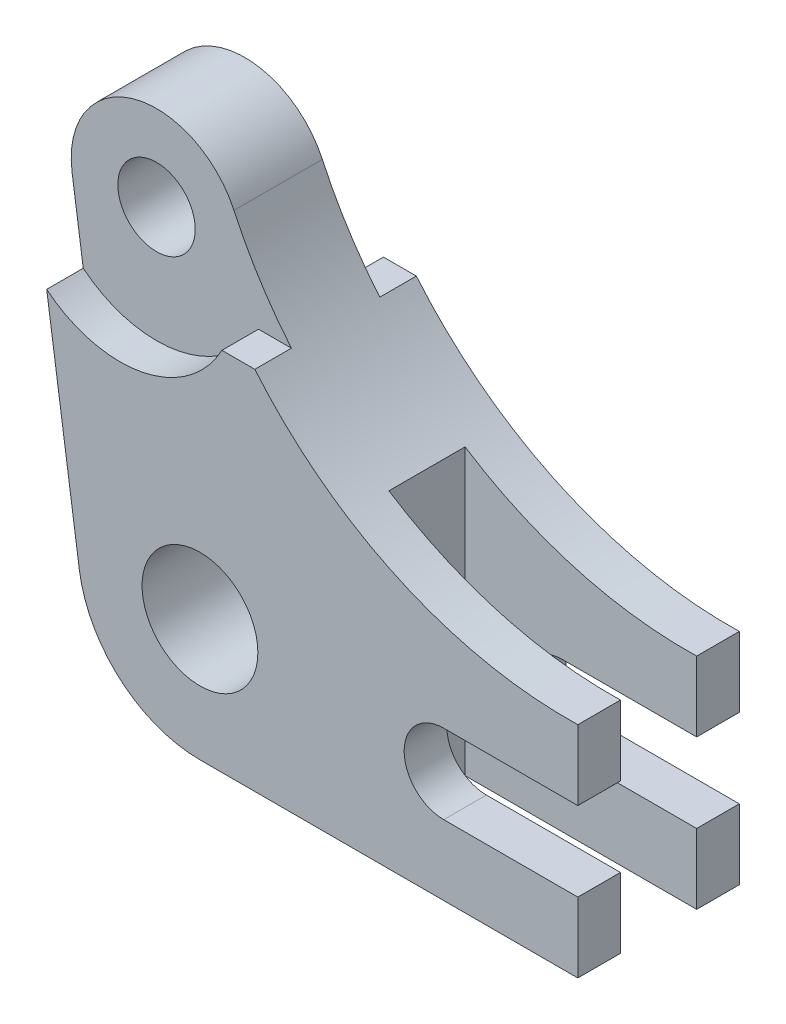
ISO-10303-21;
HEADER;
FILE_DESCRIPTION(('STEP AP214'),'2;1');
FILE_NAME('part.step','',(''),(''),'','','');
FILE_SCHEMA(('AUTOMOTIVE_DESIGN { 1 0 10303 214 1 1 1 1 }'));
ENDSEC;
DATA;
#1=APPLICATION_CONTEXT('core data for automotive mechanical design processes');
#2=APPLICATION_PROTOCOL_DEFINITION('international standard','automotive_design',2000,#1);
#3=PRODUCT_CONTEXT('',#1,'mechanical');
#4=PRODUCT('Part','Part','',(#3));
#5=PRODUCT_RELATED_PRODUCT_CATEGORY('part','',(#4));
#6=PRODUCT_DEFINITION_FORMATION('','',#4);
#7=PRODUCT_DEFINITION_CONTEXT('part definition',#1,'design');
#8=PRODUCT_DEFINITION('design','',#6,#7);
#9=PRODUCT_DEFINITION_SHAPE('','',#8);
#10=(LENGTH_UNIT() NAMED_UNIT(*) SI_UNIT(.MILLI.,.METRE.));
#11=(NAMED_UNIT(*) PLANE_ANGLE_UNIT() SI_UNIT($,.RADIAN.));
#12=(NAMED_UNIT(*) SI_UNIT($,.STERADIAN.) SOLID_ANGLE_UNIT());
#13=UNCERTAINTY_MEASURE_WITH_UNIT(LENGTH_MEASURE(1.E-05),#10,'distance_accuracy_value','');
#14=(GEOMETRIC_REPRESENTATION_CONTEXT(3) GLOBAL_UNCERTAINTY_ASSIGNED_CONTEXT((#13)) GLOBAL_UNIT_ASSIGNED_CONTEXT((#10,
#11,#12)) REPRESENTATION_CONTEXT('',''));
#15=CARTESIAN_POINT('',(0.,0.,0.));
#16=DIRECTION('',(0.,0.,1.));
#17=DIRECTION('',(1.,0.,0.));
#18=AXIS2_PLACEMENT_3D('',#15,#16,#17);
#19=CARTESIAN_POINT('',(60.3980496611483,82.9808461809184,26.5));
#20=DIRECTION('',(0.,0.,-1.));
#21=DIRECTION('',(-1.,0.,0.));
#22=AXIS2_PLACEMENT_3D('',#19,#20,#21);
#23=CYLINDRICAL_SURFACE('',#22,67.);
#24=CARTESIAN_POINT('',(60.3980496611483,82.9808461809184,0.));
#25=DIRECTION('',(0.,0.,1.));
#26=DIRECTION('',(1.,0.,0.));
#27=AXIS2_PLACEMENT_3D('',#24,#25,#26);
#28=CIRCLE('',#27,67.);
#29=CARTESIAN_POINT('',(9.00109584506863,40.,0.));
#30=VERTEX_POINT('',#29);
#31=CARTESIAN_POINT('',(62.,16.,0.));
#32=VERTEX_POINT('',#31);
#33=EDGE_CURVE('E214',#30,#32,#28,.T.);
#34=ORIENTED_EDGE('',*,*,#33,.F.);
#35=DIRECTION('',(0.,0.,1.));
#36=VECTOR('',#35,1.);
#37=CARTESIAN_POINT('',(9.0010958450686,40.,-181.42595288809));
#38=LINE('',#37,#36);
#39=CARTESIAN_POINT('',(9.00109584506863,40.,6.));
#40=VERTEX_POINT('',#39);
#41=EDGE_CURVE('E58',#30,#40,#38,.T.);
#42=ORIENTED_EDGE('',*,*,#41,.T.);
#43=CARTESIAN_POINT('',(60.3980496611483,82.9808461809184,6.));
#44=DIRECTION('',(0.,0.,1.));
#45=DIRECTION('',(1.,0.,0.));
#46=AXIS2_PLACEMENT_3D('',#43,#44,#45);
#47=CIRCLE('',#46,67.);
#48=CARTESIAN_POINT('',(-0.421043253028427,54.8732326732452,6.));
#49=VERTEX_POINT('',#48);
#50=EDGE_CURVE('E62',#49,#40,#47,.T.);
#51=ORIENTED_EDGE('',*,*,#50,.F.);
#52=DIRECTION('',(0.,0.,-1.));
#53=VECTOR('',#52,1.);
#54=CARTESIAN_POINT('',(-0.421043253028427,54.8732326732452,26.5));
#55=LINE('',#54,#53);
#56=CARTESIAN_POINT('',(-0.421043253028427,54.8732326732452,20.5));
#57=VERTEX_POINT('',#56);
#58=EDGE_CURVE('E369',#57,#49,#55,.T.);
#59=ORIENTED_EDGE('',*,*,#58,.F.);
#60=CARTESIAN_POINT('',(60.3980496611483,82.9808461809184,20.5));
#61=DIRECTION('',(0.,0.,1.));
#62=DIRECTION('',(1.,0.,0.));
#63=AXIS2_PLACEMENT_3D('',#60,#61,#62);
#64=CIRCLE('',#63,67.);
#65=CARTESIAN_POINT('',(9.00109584506861,40.,20.5));
#66=VERTEX_POINT('',#65);
#67=EDGE_CURVE('E238',#57,#66,#64,.T.);
#68=ORIENTED_EDGE('',*,*,#67,.T.);
#69=DIRECTION('',(0.,0.,-1.));
#70=VECTOR('',#69,1.);
#71=CARTESIAN_POINT('',(9.0010958450686,40.,206.67595288809));
#72=LINE('',#71,#70);
#73=CARTESIAN_POINT('',(9.00109584506862,40.,26.5));
#74=VERTEX_POINT('',#73);
#75=EDGE_CURVE('E255',#74,#66,#72,.T.);
#76=ORIENTED_EDGE('',*,*,#75,.F.);
#77=CARTESIAN_POINT('',(60.3980496611483,82.9808461809184,26.5));
#78=DIRECTION('',(0.,0.,1.));
#79=DIRECTION('',(1.,0.,0.));
#80=AXIS2_PLACEMENT_3D('',#77,#78,#79);
#81=CIRCLE('',#80,67.);
#82=CARTESIAN_POINT('',(62.,16.,26.5));
#83=VERTEX_POINT('',#82);
#84=EDGE_CURVE('E317',#74,#83,#81,.T.);
#85=ORIENTED_EDGE('',*,*,#84,.T.);
#86=DIRECTION('',(0.,0.,-1.));
#87=VECTOR('',#86,1.);
#88=CARTESIAN_POINT('',(62.,16.,26.5));
#89=LINE('',#88,#87);
#90=CARTESIAN_POINT('',(62.,16.,19.5));
#91=VERTEX_POINT('',#90);
#92=EDGE_CURVE('E372',#83,#91,#89,.T.);
#93=ORIENTED_EDGE('',*,*,#92,.T.);
#94=CARTESIAN_POINT('',(60.3980496611483,82.9808461809184,19.5));
#95=DIRECTION('',(0.,0.,1.));
#96=DIRECTION('',(1.,0.,0.));
#97=AXIS2_PLACEMENT_3D('',#94,#95,#96);
#98=CIRCLE('',#97,67.);
#99=CARTESIAN_POINT('',(24.,26.7297841388149,19.5));
#100=VERTEX_POINT('',#99);
#101=EDGE_CURVE('E301',#100,#91,#98,.T.);
#102=ORIENTED_EDGE('',*,*,#101,.F.);
#103=DIRECTION('',(0.,0.,-1.));
#104=VECTOR('',#103,1.);
#105=CARTESIAN_POINT('',(24.,26.7297841388149,26.5));
#106=LINE('',#105,#104);
#107=CARTESIAN_POINT('',(24.,26.7297841388149,7.));
#108=VERTEX_POINT('',#107);
#109=EDGE_CURVE('E303',#100,#108,#106,.T.);
#110=ORIENTED_EDGE('',*,*,#109,.T.);
#111=CARTESIAN_POINT('',(60.3980496611483,82.9808461809184,7.));
#112=DIRECTION('',(0.,0.,1.));
#113=DIRECTION('',(1.,0.,0.));
#114=AXIS2_PLACEMENT_3D('',#111,#112,#113);
#115=CIRCLE('',#114,67.);
#116=CARTESIAN_POINT('',(62.,16.,7.));
#117=VERTEX_POINT('',#116);
#118=EDGE_CURVE('E294',#108,#117,#115,.T.);
#119=ORIENTED_EDGE('',*,*,#118,.T.);
#120=EDGE_CURVE('E371',#117,#32,#89,.T.);
#121=ORIENTED_EDGE('',*,*,#120,.T.);
#122=EDGE_LOOP('',(#34,#42,#51,#59,#68,#76,#85,#93,#102,#110,#119,#121));
#123=FACE_BOUND('',#122,.T.);
#124=ADVANCED_FACE('F41',(#123),#23,.F.);
#125=CARTESIAN_POINT('',(-19.7951586474625,-2.85511718179681,26.5));
#126=DIRECTION('',(0.989757932373124,0.142755859089841,0.));
#127=DIRECTION('',(-0.142755859089841,0.989757932373124,0.));
#128=AXIS2_PLACEMENT_3D('',#125,#126,#127);
#129=PLANE('',#128);
#130=DIRECTION('',(0.,0.,1.));
#131=VECTOR('',#130,1.);
#132=CARTESIAN_POINT('',(-25.1523892703726,34.2877471348307,-181.42595288809));
#133=LINE('',#132,#131);
#134=CARTESIAN_POINT('',(-25.1523892703726,34.2877471348307,0.));
#135=VERTEX_POINT('',#134);
#136=CARTESIAN_POINT('',(-25.1523892703726,34.2877471348307,6.));
#137=VERTEX_POINT('',#136);
#138=EDGE_CURVE('E217',#135,#137,#133,.T.);
#139=ORIENTED_EDGE('',*,*,#138,.F.);
#140=DIRECTION('',(0.142755859089841,-0.989757932373124,0.));
#141=VECTOR('',#140,1.);
#142=CARTESIAN_POINT('',(-19.7951586474625,-2.85511718179681,0.));
#143=LINE('',#142,#141);
#144=CARTESIAN_POINT('',(-19.7951586474625,-2.85511718179681,0.));
#145=VERTEX_POINT('',#144);
#146=EDGE_CURVE('E203',#135,#145,#143,.T.);
#147=ORIENTED_EDGE('',*,*,#146,.T.);
#148=DIRECTION('',(0.,0.,-1.));
#149=VECTOR('',#148,1.);
#150=CARTESIAN_POINT('',(-19.7951586474625,-2.85511718179681,26.5));
#151=LINE('',#150,#149);
#152=CARTESIAN_POINT('',(-19.7951586474625,-2.85511718179681,26.5));
#153=VERTEX_POINT('',#152);
#154=EDGE_CURVE('E365',#153,#145,#151,.T.);
#155=ORIENTED_EDGE('',*,*,#154,.F.);
#156=DIRECTION('',(0.142755859089841,-0.989757932373124,0.));
#157=VECTOR('',#156,1.);
#158=CARTESIAN_POINT('',(-19.7951586474625,-2.85511718179681,26.5));
#159=LINE('',#158,#157);
#160=CARTESIAN_POINT('',(-25.1523892703726,34.2877471348307,26.5));
#161=VERTEX_POINT('',#160);
#162=EDGE_CURVE('E320',#161,#153,#159,.T.);
#163=ORIENTED_EDGE('',*,*,#162,.F.);
#164=DIRECTION('',(0.,0.,-1.));
#165=VECTOR('',#164,1.);
#166=CARTESIAN_POINT('',(-25.1523892703726,34.2877471348307,206.67595288809));
#167=LINE('',#166,#165);
#168=CARTESIAN_POINT('',(-25.1523892703726,34.2877471348307,20.5));
#169=VERTEX_POINT('',#168);
#170=EDGE_CURVE('E253',#161,#169,#167,.T.);
#171=ORIENTED_EDGE('',*,*,#170,.T.);
#172=DIRECTION('',(0.142755859089841,-0.989757932373124,0.));
#173=VECTOR('',#172,1.);
#174=CARTESIAN_POINT('',(-19.7951586474625,-2.85511718179681,20.5));
#175=LINE('',#174,#173);
#176=CARTESIAN_POINT('',(-26.9861214823488,47.0014179727422,20.5));
#177=VERTEX_POINT('',#176);
#178=EDGE_CURVE('E250',#177,#169,#175,.T.);
#179=ORIENTED_EDGE('',*,*,#178,.F.);
#180=DIRECTION('',(0.,0.,-1.));
#181=VECTOR('',#180,1.);
#182=CARTESIAN_POINT('',(-26.9861214823488,47.0014179727422,26.5));
#183=LINE('',#182,#181);
#184=CARTESIAN_POINT('',(-26.9861214823488,47.0014179727422,6.));
#185=VERTEX_POINT('',#184);
#186=EDGE_CURVE('E367',#177,#185,#183,.T.);
#187=ORIENTED_EDGE('',*,*,#186,.T.);
#188=DIRECTION('',(0.142755859089841,-0.989757932373124,0.));
#189=VECTOR('',#188,1.);
#190=CARTESIAN_POINT('',(-19.7951586474625,-2.85511718179681,6.));
#191=LINE('',#190,#189);
#192=EDGE_CURVE('E221',#185,#137,#191,.T.);
#193=ORIENTED_EDGE('',*,*,#192,.T.);
#194=EDGE_LOOP('',(#139,#147,#155,#163,#171,#179,#187,#193));
#195=FACE_BOUND('',#194,.T.);
#196=ADVANCED_FACE('F218',(#195),#129,.F.);
#197=CARTESIAN_POINT('',(0.,0.,0.));
#198=DIRECTION('',(0.,0.,1.));
#199=DIRECTION('',(1.,0.,0.));
#200=AXIS2_PLACEMENT_3D('',#197,#198,#199);
#201=PLANE('',#200);
#202=CARTESIAN_POINT('',(0.,0.,0.));
#203=DIRECTION('',(0.,0.,1.));
#204=DIRECTION('',(1.,0.,0.));
#205=AXIS2_PLACEMENT_3D('',#202,#203,#204);
#206=CIRCLE('',#205,9.5);
#207=CARTESIAN_POINT('',(9.5,0.,0.));
#208=VERTEX_POINT('',#207);
#209=EDGE_CURVE('E311',#208,#208,#206,.T.);
#210=ORIENTED_EDGE('',*,*,#209,.T.);
#211=EDGE_LOOP('',(#210));
#212=FACE_BOUND('',#211,.T.);
#213=DIRECTION('',(-1.,0.,0.));
#214=VECTOR('',#213,1.);
#215=CARTESIAN_POINT('',(3.60369010155645,40.,0.));
#216=LINE('',#215,#214);
#217=CARTESIAN_POINT('',(3.60369010155644,40.,0.));
#218=VERTEX_POINT('',#217);
#219=EDGE_CURVE('E231',#30,#218,#216,.T.);
#220=ORIENTED_EDGE('',*,*,#219,.F.);
#221=ORIENTED_EDGE('',*,*,#33,.T.);
#222=DIRECTION('',(0.,1.,0.));
#223=VECTOR('',#222,1.);
#224=CARTESIAN_POINT('',(62.,0.,0.));
#225=LINE('',#224,#223);
#226=CARTESIAN_POINT('',(62.,4.5,0.));
#227=VERTEX_POINT('',#226);
#228=EDGE_CURVE('E337',#227,#32,#225,.T.);
#229=ORIENTED_EDGE('',*,*,#228,.F.);
#230=DIRECTION('',(-1.,0.,0.));
#231=VECTOR('',#230,1.);
#232=CARTESIAN_POINT('',(0.,4.50000000000001,0.));
#233=LINE('',#232,#231);
#234=CARTESIAN_POINT('',(40.,4.5,0.));
#235=VERTEX_POINT('',#234);
#236=EDGE_CURVE('E334',#227,#235,#233,.T.);
#237=ORIENTED_EDGE('',*,*,#236,.T.);
#238=CARTESIAN_POINT('',(40.,-2.,0.));
#239=DIRECTION('',(0.,0.,1.));
#240=DIRECTION('',(1.,0.,0.));
#241=AXIS2_PLACEMENT_3D('',#238,#239,#240);
#242=CIRCLE('',#241,6.5);
#243=CARTESIAN_POINT('',(40.,-8.5,0.));
#244=VERTEX_POINT('',#243);
#245=EDGE_CURVE('E306',#235,#244,#242,.T.);
#246=ORIENTED_EDGE('',*,*,#245,.T.);
#247=DIRECTION('',(-1.,0.,0.));
#248=VECTOR('',#247,1.);
#249=CARTESIAN_POINT('',(0.,-8.50000000000002,0.));
#250=LINE('',#249,#248);
#251=CARTESIAN_POINT('',(62.,-8.5,0.));
#252=VERTEX_POINT('',#251);
#253=EDGE_CURVE('E346',#252,#244,#250,.T.);
#254=ORIENTED_EDGE('',*,*,#253,.F.);
#255=CARTESIAN_POINT('',(62.,-20.,0.));
#256=VERTEX_POINT('',#255);
#257=EDGE_CURVE('E340',#256,#252,#225,.T.);
#258=ORIENTED_EDGE('',*,*,#257,.F.);
#259=DIRECTION('',(1.,0.,0.));
#260=VECTOR('',#259,1.);
#261=CARTESIAN_POINT('',(0.,-20.,0.));
#262=LINE('',#261,#260);
#263=CARTESIAN_POINT('',(0.,-20.,0.));
#264=VERTEX_POINT('',#263);
#265=EDGE_CURVE('E343',#264,#256,#262,.T.);
#266=ORIENTED_EDGE('',*,*,#265,.F.);
#267=CARTESIAN_POINT('',(0.,0.,0.));
#268=DIRECTION('',(0.,0.,1.));
#269=DIRECTION('',(1.,0.,0.));
#270=AXIS2_PLACEMENT_3D('',#267,#268,#269);
#271=CIRCLE('',#270,20.);
#272=EDGE_CURVE('E210',#145,#264,#271,.T.);
#273=ORIENTED_EDGE('',*,*,#272,.F.);
#274=ORIENTED_EDGE('',*,*,#146,.F.);
#275=CARTESIAN_POINT('',(-13.1295104291251,49.,0.));
#276=DIRECTION('',(0.,0.,1.));
#277=DIRECTION('',(1.,0.,0.));
#278=AXIS2_PLACEMENT_3D('',#275,#276,#277);
#279=CIRCLE('',#278,19.);
#280=EDGE_CURVE('E207',#218,#135,#279,.F.);
#281=ORIENTED_EDGE('',*,*,#280,.F.);
#282=EDGE_LOOP('',(#220,#221,#229,#237,#246,#254,#258,#266,#273,#274,#281));
#283=FACE_BOUND('',#282,.T.);
#284=ADVANCED_FACE('F205',(#212,#283),#201,.F.);
#285=CARTESIAN_POINT('',(-13.1295104291251,49.,26.5));
#286=DIRECTION('',(0.,0.,-1.));
#287=DIRECTION('',(-1.,0.,0.));
#288=AXIS2_PLACEMENT_3D('',#285,#286,#287);
#289=CYLINDRICAL_SURFACE('',#288,14.);
#290=ORIENTED_EDGE('',*,*,#58,.T.);
#291=CARTESIAN_POINT('',(-13.1295104291251,49.,6.));
#292=DIRECTION('',(0.,0.,1.));
#293=DIRECTION('',(1.,0.,0.));
#294=AXIS2_PLACEMENT_3D('',#291,#292,#293);
#295=CIRCLE('',#294,14.);
#296=EDGE_CURVE('E240',#49,#185,#295,.T.);
#297=ORIENTED_EDGE('',*,*,#296,.T.);
#298=ORIENTED_EDGE('',*,*,#186,.F.);
#299=CARTESIAN_POINT('',(-13.1295104291251,49.,20.5));
#300=DIRECTION('',(0.,0.,1.));
#301=DIRECTION('',(1.,0.,0.));
#302=AXIS2_PLACEMENT_3D('',#299,#300,#301);
#303=CIRCLE('',#302,14.);
#304=EDGE_CURVE('E264',#57,#177,#303,.T.);
#305=ORIENTED_EDGE('',*,*,#304,.F.);
#306=EDGE_LOOP('',(#290,#297,#298,#305));
#307=FACE_BOUND('',#306,.T.);
#308=ADVANCED_FACE('F476',(#307),#289,.T.);
#309=CARTESIAN_POINT('',(-13.1295104291251,49.,26.5));
#310=DIRECTION('',(0.,0.,-1.));
#311=DIRECTION('',(-1.,0.,0.));
#312=AXIS2_PLACEMENT_3D('',#309,#310,#311);
#313=CYLINDRICAL_SURFACE('',#312,6.35);
#314=CARTESIAN_POINT('',(-13.1295104291251,49.,6.));
#315=DIRECTION('',(0.,0.,1.));
#316=DIRECTION('',(1.,0.,0.));
#317=AXIS2_PLACEMENT_3D('',#314,#315,#316);
#318=CIRCLE('',#317,6.35);
#319=CARTESIAN_POINT('',(-6.77951042912506,49.,6.));
#320=VERTEX_POINT('',#319);
#321=EDGE_CURVE('E11',#320,#320,#318,.T.);
#322=ORIENTED_EDGE('',*,*,#321,.F.);
#323=EDGE_LOOP('',(#322));
#324=FACE_BOUND('',#323,.T.);
#325=CARTESIAN_POINT('',(-13.1295104291251,49.,20.5));
#326=DIRECTION('',(0.,0.,1.));
#327=DIRECTION('',(1.,0.,0.));
#328=AXIS2_PLACEMENT_3D('',#325,#326,#327);
#329=CIRCLE('',#328,6.35);
#330=CARTESIAN_POINT('',(-6.77951042912506,49.,20.5));
#331=VERTEX_POINT('',#330);
#332=EDGE_CURVE('E45',#331,#331,#329,.T.);
#333=ORIENTED_EDGE('',*,*,#332,.T.);
#334=EDGE_LOOP('',(#333));
#335=FACE_BOUND('',#334,.T.);
#336=ADVANCED_FACE('F466',(#324,#335),#313,.F.);
#337=CARTESIAN_POINT('',(0.,0.,26.5));
#338=DIRECTION('',(0.,0.,1.));
#339=DIRECTION('',(1.,0.,0.));
#340=AXIS2_PLACEMENT_3D('',#337,#338,#339);
#341=PLANE('',#340);
#342=CARTESIAN_POINT('',(0.,0.,26.5));
#343=DIRECTION('',(0.,0.,1.));
#344=DIRECTION('',(1.,0.,0.));
#345=AXIS2_PLACEMENT_3D('',#342,#343,#344);
#346=CIRCLE('',#345,9.5);
#347=CARTESIAN_POINT('',(9.5,0.,26.5));
#348=VERTEX_POINT('',#347);
#349=EDGE_CURVE('E328',#348,#348,#346,.T.);
#350=ORIENTED_EDGE('',*,*,#349,.F.);
#351=EDGE_LOOP('',(#350));
#352=FACE_BOUND('',#351,.T.);
#353=DIRECTION('',(1.,0.,0.));
#354=VECTOR('',#353,1.);
#355=CARTESIAN_POINT('',(3.60369010155645,40.,26.5));
#356=LINE('',#355,#354);
#357=CARTESIAN_POINT('',(3.60369010155645,40.,26.5));
#358=VERTEX_POINT('',#357);
#359=EDGE_CURVE('E246',#358,#74,#356,.T.);
#360=ORIENTED_EDGE('',*,*,#359,.F.);
#361=CARTESIAN_POINT('',(-13.1295104291251,49.,26.5));
#362=DIRECTION('',(0.,0.,1.));
#363=DIRECTION('',(1.,0.,0.));
#364=AXIS2_PLACEMENT_3D('',#361,#362,#363);
#365=CIRCLE('',#364,19.);
#366=EDGE_CURVE('E243',#161,#358,#365,.T.);
#367=ORIENTED_EDGE('',*,*,#366,.F.);
#368=ORIENTED_EDGE('',*,*,#162,.T.);
#369=CARTESIAN_POINT('',(0.,0.,26.5));
#370=DIRECTION('',(0.,0.,1.));
#371=DIRECTION('',(1.,0.,0.));
#372=AXIS2_PLACEMENT_3D('',#369,#370,#371);
#373=CIRCLE('',#372,20.);
#374=CARTESIAN_POINT('',(0.,-20.,26.5));
#375=VERTEX_POINT('',#374);
#376=EDGE_CURVE('E322',#153,#375,#373,.T.);
#377=ORIENTED_EDGE('',*,*,#376,.T.);
#378=DIRECTION('',(1.,0.,0.));
#379=VECTOR('',#378,1.);
#380=CARTESIAN_POINT('',(0.,-20.,26.5));
#381=LINE('',#380,#379);
#382=CARTESIAN_POINT('',(62.,-20.,26.5));
#383=VERTEX_POINT('',#382);
#384=EDGE_CURVE('E324',#375,#383,#381,.T.);
#385=ORIENTED_EDGE('',*,*,#384,.T.);
#386=DIRECTION('',(0.,1.,0.));
#387=VECTOR('',#386,1.);
#388=CARTESIAN_POINT('',(62.,0.,26.5));
#389=LINE('',#388,#387);
#390=CARTESIAN_POINT('',(62.,-8.5,26.5));
#391=VERTEX_POINT('',#390);
#392=EDGE_CURVE('E318',#383,#391,#389,.T.);
#393=ORIENTED_EDGE('',*,*,#392,.T.);
#394=DIRECTION('',(-1.,0.,0.));
#395=VECTOR('',#394,1.);
#396=CARTESIAN_POINT('',(0.,-8.50000000000002,26.5));
#397=LINE('',#396,#395);
#398=CARTESIAN_POINT('',(40.,-8.5,26.5));
#399=VERTEX_POINT('',#398);
#400=EDGE_CURVE('E326',#391,#399,#397,.T.);
#401=ORIENTED_EDGE('',*,*,#400,.T.);
#402=CARTESIAN_POINT('',(40.,-2.,26.5));
#403=DIRECTION('',(0.,0.,1.));
#404=DIRECTION('',(1.,0.,0.));
#405=AXIS2_PLACEMENT_3D('',#402,#403,#404);
#406=CIRCLE('',#405,6.5);
#407=CARTESIAN_POINT('',(40.,4.5,26.5));
#408=VERTEX_POINT('',#407);
#409=EDGE_CURVE('E307',#408,#399,#406,.T.);
#410=ORIENTED_EDGE('',*,*,#409,.F.);
#411=DIRECTION('',(-1.,0.,0.));
#412=VECTOR('',#411,1.);
#413=CARTESIAN_POINT('',(0.,4.50000000000001,26.5));
#414=LINE('',#413,#412);
#415=CARTESIAN_POINT('',(62.,4.5,26.5));
#416=VERTEX_POINT('',#415);
#417=EDGE_CURVE('E310',#416,#408,#414,.T.);
#418=ORIENTED_EDGE('',*,*,#417,.F.);
#419=EDGE_CURVE('E314',#416,#83,#389,.T.);
#420=ORIENTED_EDGE('',*,*,#419,.T.);
#421=ORIENTED_EDGE('',*,*,#84,.F.);
#422=EDGE_LOOP('',(#360,#367,#368,#377,#385,#393,#401,#410,#418,#420,#421));
#423=FACE_BOUND('',#422,.T.);
#424=ADVANCED_FACE('F396',(#352,#423),#341,.T.);
#425=CARTESIAN_POINT('',(40.,-2.,26.5));
#426=DIRECTION('',(0.,0.,-1.));
#427=DIRECTION('',(-1.,0.,0.));
#428=AXIS2_PLACEMENT_3D('',#425,#426,#427);
#429=CYLINDRICAL_SURFACE('',#428,6.5);
#430=DIRECTION('',(0.,0.,-1.));
#431=VECTOR('',#430,1.);
#432=CARTESIAN_POINT('',(40.,4.5,26.5));
#433=LINE('',#432,#431);
#434=CARTESIAN_POINT('',(40.,4.5,7.));
#435=VERTEX_POINT('',#434);
#436=EDGE_CURVE('E379',#435,#235,#433,.T.);
#437=ORIENTED_EDGE('',*,*,#436,.F.);
#438=CARTESIAN_POINT('',(40.,-2.,7.));
#439=DIRECTION('',(0.,0.,1.));
#440=DIRECTION('',(1.,0.,0.));
#441=AXIS2_PLACEMENT_3D('',#438,#439,#440);
#442=CIRCLE('',#441,6.5);
#443=CARTESIAN_POINT('',(40.,-8.5,7.));
#444=VERTEX_POINT('',#443);
#445=EDGE_CURVE('E288',#435,#444,#442,.T.);
#446=ORIENTED_EDGE('',*,*,#445,.T.);
#447=DIRECTION('',(0.,0.,-1.));
#448=VECTOR('',#447,1.);
#449=CARTESIAN_POINT('',(40.,-8.5,26.5));
#450=LINE('',#449,#448);
#451=EDGE_CURVE('E331',#444,#244,#450,.T.);
#452=ORIENTED_EDGE('',*,*,#451,.T.);
#453=ORIENTED_EDGE('',*,*,#245,.F.);
#454=EDGE_LOOP('',(#437,#446,#452,#453));
#455=FACE_BOUND('',#454,.T.);
#456=ADVANCED_FACE('F450',(#455),#429,.F.);
#457=CARTESIAN_POINT('',(0.,4.50000000000001,26.5));
#458=DIRECTION('',(0.,-1.,0.));
#459=DIRECTION('',(1.,0.,0.));
#460=AXIS2_PLACEMENT_3D('',#457,#458,#459);
#461=PLANE('',#460);
#462=DIRECTION('',(0.,0.,-1.));
#463=VECTOR('',#462,1.);
#464=CARTESIAN_POINT('',(62.,4.5,26.5));
#465=LINE('',#464,#463);
#466=CARTESIAN_POINT('',(62.,4.5,7.));
#467=VERTEX_POINT('',#466);
#468=EDGE_CURVE('E375',#467,#227,#465,.T.);
#469=ORIENTED_EDGE('',*,*,#468,.F.);
#470=DIRECTION('',(-1.,0.,0.));
#471=VECTOR('',#470,1.);
#472=CARTESIAN_POINT('',(0.,4.50000000000001,7.));
#473=LINE('',#472,#471);
#474=EDGE_CURVE('E291',#467,#435,#473,.T.);
#475=ORIENTED_EDGE('',*,*,#474,.T.);
#476=ORIENTED_EDGE('',*,*,#436,.T.);
#477=ORIENTED_EDGE('',*,*,#236,.F.);
#478=EDGE_LOOP('',(#469,#475,#476,#477));
#479=FACE_BOUND('',#478,.T.);
#480=ADVANCED_FACE('F446',(#479),#461,.T.);
#481=CARTESIAN_POINT('',(62.,0.,26.5));
#482=DIRECTION('',(-1.,0.,0.));
#483=DIRECTION('',(0.,-1.,0.));
#484=AXIS2_PLACEMENT_3D('',#481,#482,#483);
#485=PLANE('',#484);
#486=DIRECTION('',(0.,1.,0.));
#487=VECTOR('',#486,1.);
#488=CARTESIAN_POINT('',(62.,-20.,7.));
#489=LINE('',#488,#487);
#490=EDGE_CURVE('E282',#467,#117,#489,.T.);
#491=ORIENTED_EDGE('',*,*,#490,.F.);
#492=ORIENTED_EDGE('',*,*,#468,.T.);
#493=ORIENTED_EDGE('',*,*,#228,.T.);
#494=ORIENTED_EDGE('',*,*,#120,.F.);
#495=EDGE_LOOP('',(#491,#492,#493,#494));
#496=FACE_BOUND('',#495,.T.);
#497=ADVANCED_FACE('F441',(#496),#485,.F.);
#498=CARTESIAN_POINT('',(62.,-20.,7.));
#499=VERTEX_POINT('',#498);
#500=CARTESIAN_POINT('',(62.,-8.5,7.));
#501=VERTEX_POINT('',#500);
#502=EDGE_CURVE('E279',#499,#501,#489,.T.);
#503=ORIENTED_EDGE('',*,*,#502,.F.);
#504=DIRECTION('',(0.,0.,-1.));
#505=VECTOR('',#504,1.);
#506=CARTESIAN_POINT('',(62.,-20.,26.5));
#507=LINE('',#506,#505);
#508=EDGE_CURVE('E358',#499,#256,#507,.T.);
#509=ORIENTED_EDGE('',*,*,#508,.T.);
#510=ORIENTED_EDGE('',*,*,#257,.T.);
#511=DIRECTION('',(0.,0.,-1.));
#512=VECTOR('',#511,1.);
#513=CARTESIAN_POINT('',(62.,-8.5,26.5));
#514=LINE('',#513,#512);
#515=EDGE_CURVE('E354',#501,#252,#514,.T.);
#516=ORIENTED_EDGE('',*,*,#515,.F.);
#517=EDGE_LOOP('',(#503,#509,#510,#516));
#518=FACE_BOUND('',#517,.T.);
#519=ADVANCED_FACE('F461',(#518),#485,.F.);
#520=CARTESIAN_POINT('',(0.,-8.50000000000002,26.5));
#521=DIRECTION('',(0.,-1.,0.));
#522=DIRECTION('',(1.,0.,0.));
#523=AXIS2_PLACEMENT_3D('',#520,#521,#522);
#524=PLANE('',#523);
#525=DIRECTION('',(-1.,0.,0.));
#526=VECTOR('',#525,1.);
#527=CARTESIAN_POINT('',(0.,-8.50000000000002,7.));
#528=LINE('',#527,#526);
#529=EDGE_CURVE('E383',#501,#444,#528,.T.);
#530=ORIENTED_EDGE('',*,*,#529,.F.);
#531=ORIENTED_EDGE('',*,*,#515,.T.);
#532=ORIENTED_EDGE('',*,*,#253,.T.);
#533=ORIENTED_EDGE('',*,*,#451,.F.);
#534=EDGE_LOOP('',(#530,#531,#532,#533));
#535=FACE_BOUND('',#534,.T.);
#536=ADVANCED_FACE('F457',(#535),#524,.F.);
#537=CARTESIAN_POINT('',(40.,-2.,19.5));
#538=DIRECTION('',(0.,0.,1.));
#539=DIRECTION('',(1.,0.,0.));
#540=AXIS2_PLACEMENT_3D('',#537,#538,#539);
#541=CIRCLE('',#540,6.5);
#542=CARTESIAN_POINT('',(40.,4.5,19.5));
#543=VERTEX_POINT('',#542);
#544=CARTESIAN_POINT('',(40.,-8.5,19.5));
#545=VERTEX_POINT('',#544);
#546=EDGE_CURVE('E297',#543,#545,#541,.T.);
#547=ORIENTED_EDGE('',*,*,#546,.F.);
#548=EDGE_CURVE('E380',#408,#543,#433,.T.);
#549=ORIENTED_EDGE('',*,*,#548,.F.);
#550=ORIENTED_EDGE('',*,*,#409,.T.);
#551=EDGE_CURVE('E351',#399,#545,#450,.T.);
#552=ORIENTED_EDGE('',*,*,#551,.T.);
#553=EDGE_LOOP('',(#547,#549,#550,#552));
#554=FACE_BOUND('',#553,.T.);
#555=ADVANCED_FACE('F43',(#554),#429,.F.);
#556=DIRECTION('',(-1.,0.,0.));
#557=VECTOR('',#556,1.);
#558=CARTESIAN_POINT('',(0.,4.50000000000001,19.5));
#559=LINE('',#558,#557);
#560=CARTESIAN_POINT('',(62.,4.5,19.5));
#561=VERTEX_POINT('',#560);
#562=EDGE_CURVE('E299',#561,#543,#559,.T.);
#563=ORIENTED_EDGE('',*,*,#562,.F.);
#564=EDGE_CURVE('E376',#416,#561,#465,.T.);
#565=ORIENTED_EDGE('',*,*,#564,.F.);
#566=ORIENTED_EDGE('',*,*,#417,.T.);
#567=ORIENTED_EDGE('',*,*,#548,.T.);
#568=EDGE_LOOP('',(#563,#565,#566,#567));
#569=FACE_BOUND('',#568,.T.);
#570=ADVANCED_FACE('F399',(#569),#461,.T.);
#571=ORIENTED_EDGE('',*,*,#564,.T.);
#572=DIRECTION('',(0.,1.,0.));
#573=VECTOR('',#572,1.);
#574=CARTESIAN_POINT('',(62.,-20.,19.5));
#575=LINE('',#574,#573);
#576=EDGE_CURVE('E273',#561,#91,#575,.T.);
#577=ORIENTED_EDGE('',*,*,#576,.T.);
#578=ORIENTED_EDGE('',*,*,#92,.F.);
#579=ORIENTED_EDGE('',*,*,#419,.F.);
#580=EDGE_LOOP('',(#571,#577,#578,#579));
#581=FACE_BOUND('',#580,.T.);
#582=ADVANCED_FACE('F404',(#581),#485,.F.);
#583=CARTESIAN_POINT('',(0.,0.,26.5));
#584=DIRECTION('',(0.,0.,-1.));
#585=DIRECTION('',(-1.,0.,0.));
#586=AXIS2_PLACEMENT_3D('',#583,#584,#585);
#587=CYLINDRICAL_SURFACE('',#586,20.);
#588=ORIENTED_EDGE('',*,*,#272,.T.);
#589=DIRECTION('',(0.,0.,-1.));
#590=VECTOR('',#589,1.);
#591=CARTESIAN_POINT('',(0.,-20.,26.5));
#592=LINE('',#591,#590);
#593=EDGE_CURVE('E362',#375,#264,#592,.T.);
#594=ORIENTED_EDGE('',*,*,#593,.F.);
#595=ORIENTED_EDGE('',*,*,#376,.F.);
#596=ORIENTED_EDGE('',*,*,#154,.T.);
#597=EDGE_LOOP('',(#588,#594,#595,#596));
#598=FACE_BOUND('',#597,.T.);
#599=ADVANCED_FACE('F418',(#598),#587,.T.);
#600=CARTESIAN_POINT('',(0.,-20.,26.5));
#601=DIRECTION('',(0.,1.,0.));
#602=DIRECTION('',(0.,0.,1.));
#603=AXIS2_PLACEMENT_3D('',#600,#601,#602);
#604=PLANE('',#603);
#605=DIRECTION('',(0.,0.,-1.));
#606=VECTOR('',#605,1.);
#607=CARTESIAN_POINT('',(24.,-20.,19.5));
#608=LINE('',#607,#606);
#609=CARTESIAN_POINT('',(24.,-20.,19.5));
#610=VERTEX_POINT('',#609);
#611=CARTESIAN_POINT('',(24.,-20.,7.));
#612=VERTEX_POINT('',#611);
#613=EDGE_CURVE('E278',#610,#612,#608,.T.);
#614=ORIENTED_EDGE('',*,*,#613,.F.);
#615=DIRECTION('',(1.,0.,0.));
#616=VECTOR('',#615,1.);
#617=CARTESIAN_POINT('',(62.,-20.,19.5));
#618=LINE('',#617,#616);
#619=CARTESIAN_POINT('',(62.,-20.,19.5));
#620=VERTEX_POINT('',#619);
#621=EDGE_CURVE('E275',#610,#620,#618,.T.);
#622=ORIENTED_EDGE('',*,*,#621,.T.);
#623=EDGE_CURVE('E359',#383,#620,#507,.T.);
#624=ORIENTED_EDGE('',*,*,#623,.F.);
#625=ORIENTED_EDGE('',*,*,#384,.F.);
#626=ORIENTED_EDGE('',*,*,#593,.T.);
#627=ORIENTED_EDGE('',*,*,#265,.T.);
#628=ORIENTED_EDGE('',*,*,#508,.F.);
#629=DIRECTION('',(1.,0.,0.));
#630=VECTOR('',#629,1.);
#631=CARTESIAN_POINT('',(62.,-20.,7.));
#632=LINE('',#631,#630);
#633=EDGE_CURVE('E284',#612,#499,#632,.T.);
#634=ORIENTED_EDGE('',*,*,#633,.F.);
#635=EDGE_LOOP('',(#614,#622,#624,#625,#626,#627,#628,#634));
#636=FACE_BOUND('',#635,.T.);
#637=ADVANCED_FACE('F424',(#636),#604,.F.);
#638=ORIENTED_EDGE('',*,*,#623,.T.);
#639=CARTESIAN_POINT('',(62.,-8.5,19.5));
#640=VERTEX_POINT('',#639);
#641=EDGE_CURVE('E269',#620,#640,#575,.T.);
#642=ORIENTED_EDGE('',*,*,#641,.T.);
#643=EDGE_CURVE('E355',#391,#640,#514,.T.);
#644=ORIENTED_EDGE('',*,*,#643,.F.);
#645=ORIENTED_EDGE('',*,*,#392,.F.);
#646=EDGE_LOOP('',(#638,#642,#644,#645));
#647=FACE_BOUND('',#646,.T.);
#648=ADVANCED_FACE('F427',(#647),#485,.F.);
#649=CARTESIAN_POINT('',(0.,0.,26.5));
#650=DIRECTION('',(0.,0.,-1.));
#651=DIRECTION('',(-1.,0.,0.));
#652=AXIS2_PLACEMENT_3D('',#649,#650,#651);
#653=CYLINDRICAL_SURFACE('',#652,9.5);
#654=ORIENTED_EDGE('',*,*,#349,.T.);
#655=EDGE_LOOP('',(#654));
#656=FACE_BOUND('',#655,.T.);
#657=ORIENTED_EDGE('',*,*,#209,.F.);
#658=EDGE_LOOP('',(#657));
#659=FACE_BOUND('',#658,.T.);
#660=ADVANCED_FACE('F529',(#656,#659),#653,.F.);
#661=ORIENTED_EDGE('',*,*,#643,.T.);
#662=DIRECTION('',(-1.,0.,0.));
#663=VECTOR('',#662,1.);
#664=CARTESIAN_POINT('',(0.,-8.50000000000002,19.5));
#665=LINE('',#664,#663);
#666=EDGE_CURVE('E50',#640,#545,#665,.T.);
#667=ORIENTED_EDGE('',*,*,#666,.T.);
#668=ORIENTED_EDGE('',*,*,#551,.F.);
#669=ORIENTED_EDGE('',*,*,#400,.F.);
#670=EDGE_LOOP('',(#661,#667,#668,#669));
#671=FACE_BOUND('',#670,.T.);
#672=ADVANCED_FACE('F387',(#671),#524,.F.);
#673=CARTESIAN_POINT('',(24.,-20.,19.5));
#674=DIRECTION('',(1.,0.,0.));
#675=DIRECTION('',(0.,0.,-1.));
#676=AXIS2_PLACEMENT_3D('',#673,#674,#675);
#677=PLANE('',#676);
#678=DIRECTION('',(0.,-1.,0.));
#679=VECTOR('',#678,1.);
#680=CARTESIAN_POINT('',(24.,-20.,19.5));
#681=LINE('',#680,#679);
#682=EDGE_CURVE('E272',#100,#610,#681,.T.);
#683=ORIENTED_EDGE('',*,*,#682,.T.);
#684=ORIENTED_EDGE('',*,*,#613,.T.);
#685=DIRECTION('',(0.,-1.,0.));
#686=VECTOR('',#685,1.);
#687=CARTESIAN_POINT('',(24.,-20.,7.));
#688=LINE('',#687,#686);
#689=EDGE_CURVE('E281',#108,#612,#688,.T.);
#690=ORIENTED_EDGE('',*,*,#689,.F.);
#691=ORIENTED_EDGE('',*,*,#109,.F.);
#692=EDGE_LOOP('',(#683,#684,#690,#691));
#693=FACE_BOUND('',#692,.T.);
#694=ADVANCED_FACE('F435',(#693),#677,.T.);
#695=CARTESIAN_POINT('',(0.,0.,19.5));
#696=DIRECTION('',(0.,0.,1.));
#697=DIRECTION('',(1.,0.,0.));
#698=AXIS2_PLACEMENT_3D('',#695,#696,#697);
#699=PLANE('',#698);
#700=ORIENTED_EDGE('',*,*,#101,.T.);
#701=ORIENTED_EDGE('',*,*,#576,.F.);
#702=ORIENTED_EDGE('',*,*,#562,.T.);
#703=ORIENTED_EDGE('',*,*,#546,.T.);
#704=ORIENTED_EDGE('',*,*,#666,.F.);
#705=ORIENTED_EDGE('',*,*,#641,.F.);
#706=ORIENTED_EDGE('',*,*,#621,.F.);
#707=ORIENTED_EDGE('',*,*,#682,.F.);
#708=EDGE_LOOP('',(#700,#701,#702,#703,#704,#705,#706,#707));
#709=FACE_BOUND('',#708,.T.);
#710=ADVANCED_FACE('F428',(#709),#699,.F.);
#711=CARTESIAN_POINT('',(0.,0.,7.));
#712=DIRECTION('',(0.,0.,1.));
#713=DIRECTION('',(1.,0.,0.));
#714=AXIS2_PLACEMENT_3D('',#711,#712,#713);
#715=PLANE('',#714);
#716=ORIENTED_EDGE('',*,*,#689,.T.);
#717=ORIENTED_EDGE('',*,*,#633,.T.);
#718=ORIENTED_EDGE('',*,*,#502,.T.);
#719=ORIENTED_EDGE('',*,*,#529,.T.);
#720=ORIENTED_EDGE('',*,*,#445,.F.);
#721=ORIENTED_EDGE('',*,*,#474,.F.);
#722=ORIENTED_EDGE('',*,*,#490,.T.);
#723=ORIENTED_EDGE('',*,*,#118,.F.);
#724=EDGE_LOOP('',(#716,#717,#718,#719,#720,#721,#722,#723));
#725=FACE_BOUND('',#724,.T.);
#726=ADVANCED_FACE('F462',(#725),#715,.T.);
#727=CARTESIAN_POINT('',(3.60369010155645,40.,206.67595288809));
#728=DIRECTION('',(0.,1.,0.));
#729=DIRECTION('',(0.,0.,1.));
#730=AXIS2_PLACEMENT_3D('',#727,#728,#729);
#731=PLANE('',#730);
#732=DIRECTION('',(0.,0.,-1.));
#733=VECTOR('',#732,1.);
#734=CARTESIAN_POINT('',(3.60369010155645,40.,206.67595288809));
#735=LINE('',#734,#733);
#736=CARTESIAN_POINT('',(3.60369010155645,40.,20.5));
#737=VERTEX_POINT('',#736);
#738=EDGE_CURVE('E258',#358,#737,#735,.T.);
#739=ORIENTED_EDGE('',*,*,#738,.F.);
#740=ORIENTED_EDGE('',*,*,#359,.T.);
#741=ORIENTED_EDGE('',*,*,#75,.T.);
#742=DIRECTION('',(1.,0.,0.));
#743=VECTOR('',#742,1.);
#744=CARTESIAN_POINT('',(3.60369010155645,40.,20.5));
#745=LINE('',#744,#743);
#746=EDGE_CURVE('E249',#737,#66,#745,.T.);
#747=ORIENTED_EDGE('',*,*,#746,.F.);
#748=EDGE_LOOP('',(#739,#740,#741,#747));
#749=FACE_BOUND('',#748,.T.);
#750=ADVANCED_FACE('F408',(#749),#731,.T.);
#751=CARTESIAN_POINT('',(-13.1295104291251,49.,206.67595288809));
#752=DIRECTION('',(0.,0.,-1.));
#753=DIRECTION('',(-1.,0.,0.));
#754=AXIS2_PLACEMENT_3D('',#751,#752,#753);
#755=CYLINDRICAL_SURFACE('',#754,19.);
#756=ORIENTED_EDGE('',*,*,#170,.F.);
#757=ORIENTED_EDGE('',*,*,#366,.T.);
#758=ORIENTED_EDGE('',*,*,#738,.T.);
#759=CARTESIAN_POINT('',(-13.1295104291251,49.,20.5));
#760=DIRECTION('',(0.,0.,1.));
#761=DIRECTION('',(1.,0.,0.));
#762=AXIS2_PLACEMENT_3D('',#759,#760,#761);
#763=CIRCLE('',#762,19.);
#764=EDGE_CURVE('E247',#169,#737,#763,.T.);
#765=ORIENTED_EDGE('',*,*,#764,.F.);
#766=EDGE_LOOP('',(#756,#757,#758,#765));
#767=FACE_BOUND('',#766,.T.);
#768=ADVANCED_FACE('F413',(#767),#755,.F.);
#769=CARTESIAN_POINT('',(0.,0.,20.5));
#770=DIRECTION('',(0.,0.,1.));
#771=DIRECTION('',(1.,0.,0.));
#772=AXIS2_PLACEMENT_3D('',#769,#770,#771);
#773=PLANE('',#772);
#774=ORIENTED_EDGE('',*,*,#332,.F.);
#775=EDGE_LOOP('',(#774));
#776=FACE_BOUND('',#775,.T.);
#777=ORIENTED_EDGE('',*,*,#764,.T.);
#778=ORIENTED_EDGE('',*,*,#746,.T.);
#779=ORIENTED_EDGE('',*,*,#67,.F.);
#780=ORIENTED_EDGE('',*,*,#304,.T.);
#781=ORIENTED_EDGE('',*,*,#178,.T.);
#782=EDGE_LOOP('',(#777,#778,#779,#780,#781));
#783=FACE_BOUND('',#782,.T.);
#784=ADVANCED_FACE('F468',(#776,#783),#773,.T.);
#785=CARTESIAN_POINT('',(3.60369010155645,40.,-181.42595288809));
#786=DIRECTION('',(0.,-1.,0.));
#787=DIRECTION('',(0.,0.,-1.));
#788=AXIS2_PLACEMENT_3D('',#785,#786,#787);
#789=PLANE('',#788);
#790=ORIENTED_EDGE('',*,*,#219,.T.);
#791=DIRECTION('',(0.,0.,1.));
#792=VECTOR('',#791,1.);
#793=CARTESIAN_POINT('',(3.60369010155644,40.,-181.42595288809));
#794=LINE('',#793,#792);
#795=CARTESIAN_POINT('',(3.60369010155644,40.,6.));
#796=VERTEX_POINT('',#795);
#797=EDGE_CURVE('E228',#218,#796,#794,.T.);
#798=ORIENTED_EDGE('',*,*,#797,.T.);
#799=DIRECTION('',(-1.,0.,0.));
#800=VECTOR('',#799,1.);
#801=CARTESIAN_POINT('',(3.60369010155645,40.,6.00000000000001));
#802=LINE('',#801,#800);
#803=EDGE_CURVE('E224',#40,#796,#802,.T.);
#804=ORIENTED_EDGE('',*,*,#803,.F.);
#805=ORIENTED_EDGE('',*,*,#41,.F.);
#806=EDGE_LOOP('',(#790,#798,#804,#805));
#807=FACE_BOUND('',#806,.T.);
#808=ADVANCED_FACE('F471',(#807),#789,.F.);
#809=CARTESIAN_POINT('',(-13.1295104291251,49.,-181.42595288809));
#810=DIRECTION('',(0.,0.,1.));
#811=DIRECTION('',(1.,0.,0.));
#812=AXIS2_PLACEMENT_3D('',#809,#810,#811);
#813=CYLINDRICAL_SURFACE('',#812,19.);
#814=ORIENTED_EDGE('',*,*,#280,.T.);
#815=ORIENTED_EDGE('',*,*,#138,.T.);
#816=CARTESIAN_POINT('',(-13.1295104291251,49.,6.00000000000001));
#817=DIRECTION('',(0.,0.,1.));
#818=DIRECTION('',(1.,0.,0.));
#819=AXIS2_PLACEMENT_3D('',#816,#817,#818);
#820=CIRCLE('',#819,19.);
#821=EDGE_CURVE('E230',#796,#137,#820,.F.);
#822=ORIENTED_EDGE('',*,*,#821,.F.);
#823=ORIENTED_EDGE('',*,*,#797,.F.);
#824=EDGE_LOOP('',(#814,#815,#822,#823));
#825=FACE_BOUND('',#824,.T.);
#826=ADVANCED_FACE('F226',(#825),#813,.F.);
#827=CARTESIAN_POINT('',(0.,0.,6.));
#828=DIRECTION('',(0.,0.,1.));
#829=DIRECTION('',(1.,0.,0.));
#830=AXIS2_PLACEMENT_3D('',#827,#828,#829);
#831=PLANE('',#830);
#832=ORIENTED_EDGE('',*,*,#321,.T.);
#833=EDGE_LOOP('',(#832));
#834=FACE_BOUND('',#833,.T.);
#835=ORIENTED_EDGE('',*,*,#821,.T.);
#836=ORIENTED_EDGE('',*,*,#192,.F.);
#837=ORIENTED_EDGE('',*,*,#296,.F.);
#838=ORIENTED_EDGE('',*,*,#50,.T.);
#839=ORIENTED_EDGE('',*,*,#803,.T.);
#840=EDGE_LOOP('',(#835,#836,#837,#838,#839));
#841=FACE_BOUND('',#840,.T.);
#842=ADVANCED_FACE('F479',(#834,#841),#831,.F.);
#843=CLOSED_SHELL('',(#124,#196,#284,#308,#336,#424,#456,#480,#497,#519,#536,#555,#570,#582,
#599,#637,#648,#660,#672,#694,#710,#726,#750,#768,#784,#808,#826,#842));
#844=MANIFOLD_SOLID_BREP('B2',#843);
#845=ADVANCED_BREP_SHAPE_REPRESENTATION('',(#18,#844),#14);
#846=SHAPE_DEFINITION_REPRESENTATION(#9,#845);
ENDSEC;
END-ISO-10303-21;
